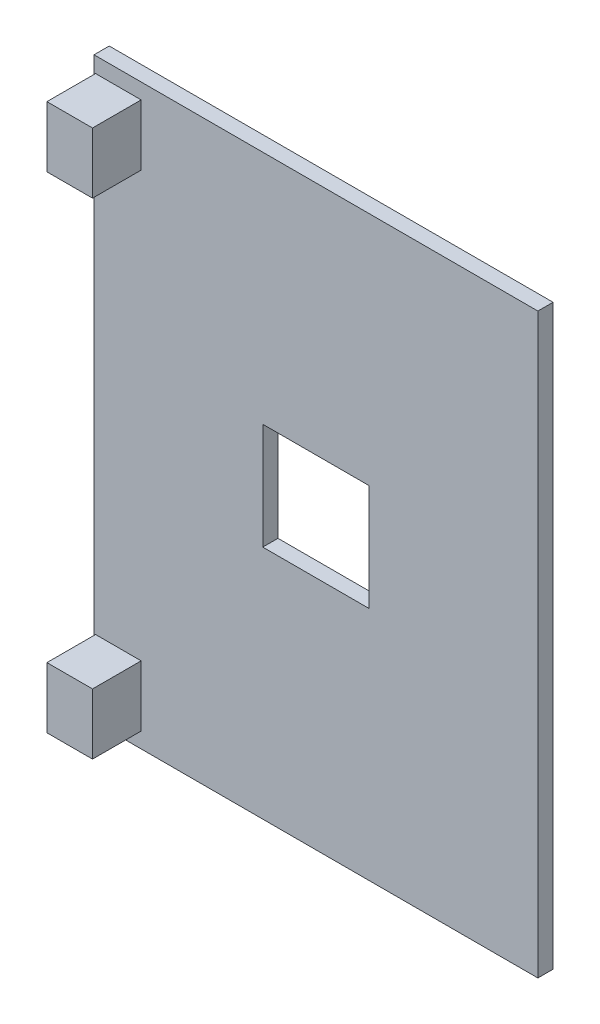
ISO-10303-21;
HEADER;
FILE_DESCRIPTION(('STEP AP214'),'2;1');
FILE_NAME('part.step','',(''),(''),'','','');
FILE_SCHEMA(('AUTOMOTIVE_DESIGN { 1 0 10303 214 1 1 1 1 }'));
ENDSEC;
DATA;
#1=APPLICATION_CONTEXT('core data for automotive mechanical design processes');
#2=APPLICATION_PROTOCOL_DEFINITION('international standard','automotive_design',2000,#1);
#3=PRODUCT_CONTEXT('',#1,'mechanical');
#4=PRODUCT('Part','Part','',(#3));
#5=PRODUCT_RELATED_PRODUCT_CATEGORY('part','',(#4));
#6=PRODUCT_DEFINITION_FORMATION('','',#4);
#7=PRODUCT_DEFINITION_CONTEXT('part definition',#1,'design');
#8=PRODUCT_DEFINITION('design','',#6,#7);
#9=PRODUCT_DEFINITION_SHAPE('','',#8);
#10=(LENGTH_UNIT() NAMED_UNIT(*) SI_UNIT(.MILLI.,.METRE.));
#11=(NAMED_UNIT(*) PLANE_ANGLE_UNIT() SI_UNIT($,.RADIAN.));
#12=(NAMED_UNIT(*) SI_UNIT($,.STERADIAN.) SOLID_ANGLE_UNIT());
#13=UNCERTAINTY_MEASURE_WITH_UNIT(LENGTH_MEASURE(1.E-05),#10,'distance_accuracy_value','');
#14=(GEOMETRIC_REPRESENTATION_CONTEXT(3) GLOBAL_UNCERTAINTY_ASSIGNED_CONTEXT((#13)) GLOBAL_UNIT_ASSIGNED_CONTEXT((#10,
#11,#12)) REPRESENTATION_CONTEXT('',''));
#15=CARTESIAN_POINT('',(0.,0.,0.));
#16=DIRECTION('',(0.,0.,1.));
#17=DIRECTION('',(1.,0.,0.));
#18=AXIS2_PLACEMENT_3D('',#15,#16,#17);
#19=CARTESIAN_POINT('',(0.,0.,5.));
#20=DIRECTION('',(0.,0.,1.));
#21=DIRECTION('',(1.,0.,0.));
#22=AXIS2_PLACEMENT_3D('',#19,#20,#21);
#23=PLANE('',#22);
#24=DIRECTION('',(0.,-1.,0.));
#25=VECTOR('',#24,1.);
#26=CARTESIAN_POINT('',(-52.728613981203,0.694490742526819,5.));
#27=LINE('',#26,#25);
#28=CARTESIAN_POINT('',(-52.728613981203,35.6944907425268,5.));
#29=VERTEX_POINT('',#28);
#30=CARTESIAN_POINT('',(-52.728613981203,0.694490742526819,5.));
#31=VERTEX_POINT('',#30);
#32=EDGE_CURVE('E48',#29,#31,#27,.T.);
#33=ORIENTED_EDGE('',*,*,#32,.F.);
#34=DIRECTION('',(-1.,0.,0.));
#35=VECTOR('',#34,1.);
#36=CARTESIAN_POINT('',(-17.728613981203,35.6944907425268,5.));
#37=LINE('',#36,#35);
#38=CARTESIAN_POINT('',(-17.728613981203,35.6944907425268,5.));
#39=VERTEX_POINT('',#38);
#40=EDGE_CURVE('E164',#39,#29,#37,.T.);
#41=ORIENTED_EDGE('',*,*,#40,.F.);
#42=DIRECTION('',(0.,1.,0.));
#43=VECTOR('',#42,1.);
#44=CARTESIAN_POINT('',(-17.728613981203,0.694490742526824,5.));
#45=LINE('',#44,#43);
#46=CARTESIAN_POINT('',(-17.728613981203,0.694490742526824,5.));
#47=VERTEX_POINT('',#46);
#48=EDGE_CURVE('E149',#47,#39,#45,.T.);
#49=ORIENTED_EDGE('',*,*,#48,.F.);
#50=DIRECTION('',(1.,0.,0.));
#51=VECTOR('',#50,1.);
#52=CARTESIAN_POINT('',(-17.728613981203,0.694490742526824,5.));
#53=LINE('',#52,#51);
#54=EDGE_CURVE('E158',#31,#47,#53,.T.);
#55=ORIENTED_EDGE('',*,*,#54,.F.);
#56=EDGE_LOOP('',(#33,#41,#49,#55));
#57=FACE_BOUND('',#56,.T.);
#58=DIRECTION('',(0.,-1.,0.));
#59=VECTOR('',#58,1.);
#60=CARTESIAN_POINT('',(-108.228613981203,113.194490742527,5.));
#61=LINE('',#60,#59);
#62=CARTESIAN_POINT('',(-108.228613981203,113.194490742527,5.));
#63=VERTEX_POINT('',#62);
#64=CARTESIAN_POINT('',(-108.228613981203,-76.8055092574732,5.));
#65=VERTEX_POINT('',#64);
#66=EDGE_CURVE('E235',#63,#65,#61,.T.);
#67=ORIENTED_EDGE('',*,*,#66,.T.);
#68=DIRECTION('',(1.,0.,0.));
#69=VECTOR('',#68,1.);
#70=CARTESIAN_POINT('',(-108.228613981203,-76.8055092574732,5.));
#71=LINE('',#70,#69);
#72=CARTESIAN_POINT('',(37.771386018797,-76.8055092574732,5.));
#73=VERTEX_POINT('',#72);
#74=EDGE_CURVE('E238',#65,#73,#71,.T.);
#75=ORIENTED_EDGE('',*,*,#74,.T.);
#76=DIRECTION('',(0.,1.,0.));
#77=VECTOR('',#76,1.);
#78=CARTESIAN_POINT('',(37.771386018797,113.194490742527,5.));
#79=LINE('',#78,#77);
#80=CARTESIAN_POINT('',(37.771386018797,113.194490742527,5.));
#81=VERTEX_POINT('',#80);
#82=EDGE_CURVE('E241',#73,#81,#79,.T.);
#83=ORIENTED_EDGE('',*,*,#82,.T.);
#84=DIRECTION('',(-1.,0.,0.));
#85=VECTOR('',#84,1.);
#86=CARTESIAN_POINT('',(-108.228613981203,113.194490742527,5.));
#87=LINE('',#86,#85);
#88=EDGE_CURVE('E243',#81,#63,#87,.T.);
#89=ORIENTED_EDGE('',*,*,#88,.T.);
#90=EDGE_LOOP('',(#67,#75,#83,#89));
#91=FACE_BOUND('',#90,.T.);
#92=DIRECTION('',(1.,0.,0.));
#93=VECTOR('',#92,1.);
#94=CARTESIAN_POINT('',(-107.728613981203,-71.7055092574732,5.));
#95=LINE('',#94,#93);
#96=CARTESIAN_POINT('',(-107.728613981203,-71.7055092574732,5.));
#97=VERTEX_POINT('',#96);
#98=CARTESIAN_POINT('',(-92.728613981203,-71.7055092574732,5.));
#99=VERTEX_POINT('',#98);
#100=EDGE_CURVE('E219',#97,#99,#95,.T.);
#101=ORIENTED_EDGE('',*,*,#100,.F.);
#102=DIRECTION('',(0.,-1.,0.));
#103=VECTOR('',#102,1.);
#104=CARTESIAN_POINT('',(-107.728613981203,-71.7055092574732,5.));
#105=LINE('',#104,#103);
#106=CARTESIAN_POINT('',(-107.728613981203,-51.7055092574732,5.));
#107=VERTEX_POINT('',#106);
#108=EDGE_CURVE('E205',#107,#97,#105,.T.);
#109=ORIENTED_EDGE('',*,*,#108,.F.);
#110=DIRECTION('',(-1.,0.,0.));
#111=VECTOR('',#110,1.);
#112=CARTESIAN_POINT('',(-107.728613981203,-51.7055092574732,5.));
#113=LINE('',#112,#111);
#114=CARTESIAN_POINT('',(-92.728613981203,-51.7055092574732,5.));
#115=VERTEX_POINT('',#114);
#116=EDGE_CURVE('E210',#115,#107,#113,.T.);
#117=ORIENTED_EDGE('',*,*,#116,.F.);
#118=DIRECTION('',(0.,1.,0.));
#119=VECTOR('',#118,1.);
#120=CARTESIAN_POINT('',(-92.728613981203,-71.7055092574732,5.));
#121=LINE('',#120,#119);
#122=EDGE_CURVE('E221',#99,#115,#121,.T.);
#123=ORIENTED_EDGE('',*,*,#122,.F.);
#124=EDGE_LOOP('',(#101,#109,#117,#123));
#125=FACE_BOUND('',#124,.T.);
#126=DIRECTION('',(1.,0.,0.));
#127=VECTOR('',#126,1.);
#128=CARTESIAN_POINT('',(-107.728613981203,88.0944907425268,5.));
#129=LINE('',#128,#127);
#130=CARTESIAN_POINT('',(-107.728613981203,88.0944907425268,5.));
#131=VERTEX_POINT('',#130);
#132=CARTESIAN_POINT('',(-92.728613981203,88.0944907425268,5.));
#133=VERTEX_POINT('',#132);
#134=EDGE_CURVE('E190',#131,#133,#129,.T.);
#135=ORIENTED_EDGE('',*,*,#134,.F.);
#136=DIRECTION('',(0.,-1.,0.));
#137=VECTOR('',#136,1.);
#138=CARTESIAN_POINT('',(-107.728613981203,108.094490742527,5.));
#139=LINE('',#138,#137);
#140=CARTESIAN_POINT('',(-107.728613981203,108.094490742527,5.));
#141=VERTEX_POINT('',#140);
#142=EDGE_CURVE('E175',#141,#131,#139,.T.);
#143=ORIENTED_EDGE('',*,*,#142,.F.);
#144=DIRECTION('',(-1.,0.,0.));
#145=VECTOR('',#144,1.);
#146=CARTESIAN_POINT('',(-107.728613981203,108.094490742527,5.));
#147=LINE('',#146,#145);
#148=CARTESIAN_POINT('',(-92.728613981203,108.094490742527,5.));
#149=VERTEX_POINT('',#148);
#150=EDGE_CURVE('E181',#149,#141,#147,.T.);
#151=ORIENTED_EDGE('',*,*,#150,.F.);
#152=DIRECTION('',(0.,1.,0.));
#153=VECTOR('',#152,1.);
#154=CARTESIAN_POINT('',(-92.728613981203,108.094490742527,5.));
#155=LINE('',#154,#153);
#156=EDGE_CURVE('E192',#133,#149,#155,.T.);
#157=ORIENTED_EDGE('',*,*,#156,.F.);
#158=EDGE_LOOP('',(#135,#143,#151,#157));
#159=FACE_BOUND('',#158,.T.);
#160=ADVANCED_FACE('F33',(#57,#91,#125,#159),#23,.T.);
#161=CARTESIAN_POINT('',(-108.228613981203,113.194490742527,5.));
#162=DIRECTION('',(1.,0.,0.));
#163=DIRECTION('',(0.,1.,0.));
#164=AXIS2_PLACEMENT_3D('',#161,#162,#163);
#165=PLANE('',#164);
#166=DIRECTION('',(0.,-1.,0.));
#167=VECTOR('',#166,1.);
#168=CARTESIAN_POINT('',(-108.228613981203,113.194490742527,0.));
#169=LINE('',#168,#167);
#170=CARTESIAN_POINT('',(-108.228613981203,113.194490742527,0.));
#171=VERTEX_POINT('',#170);
#172=CARTESIAN_POINT('',(-108.228613981203,-76.8055092574732,0.));
#173=VERTEX_POINT('',#172);
#174=EDGE_CURVE('E234',#171,#173,#169,.T.);
#175=ORIENTED_EDGE('',*,*,#174,.T.);
#176=DIRECTION('',(0.,0.,-1.));
#177=VECTOR('',#176,1.);
#178=CARTESIAN_POINT('',(-108.228613981203,-76.8055092574732,5.));
#179=LINE('',#178,#177);
#180=EDGE_CURVE('E11',#65,#173,#179,.T.);
#181=ORIENTED_EDGE('',*,*,#180,.F.);
#182=ORIENTED_EDGE('',*,*,#66,.F.);
#183=DIRECTION('',(0.,0.,-1.));
#184=VECTOR('',#183,1.);
#185=CARTESIAN_POINT('',(-108.228613981203,113.194490742527,5.));
#186=LINE('',#185,#184);
#187=EDGE_CURVE('E245',#63,#171,#186,.T.);
#188=ORIENTED_EDGE('',*,*,#187,.T.);
#189=EDGE_LOOP('',(#175,#181,#182,#188));
#190=FACE_BOUND('',#189,.T.);
#191=ADVANCED_FACE('F35',(#190),#165,.F.);
#192=CARTESIAN_POINT('',(-108.228613981203,-76.8055092574732,5.));
#193=DIRECTION('',(0.,1.,0.));
#194=DIRECTION('',(0.,0.,1.));
#195=AXIS2_PLACEMENT_3D('',#192,#193,#194);
#196=PLANE('',#195);
#197=DIRECTION('',(1.,0.,0.));
#198=VECTOR('',#197,1.);
#199=CARTESIAN_POINT('',(-108.228613981203,-76.8055092574732,0.));
#200=LINE('',#199,#198);
#201=CARTESIAN_POINT('',(37.771386018797,-76.8055092574732,0.));
#202=VERTEX_POINT('',#201);
#203=EDGE_CURVE('E248',#173,#202,#200,.T.);
#204=ORIENTED_EDGE('',*,*,#203,.T.);
#205=DIRECTION('',(0.,0.,-1.));
#206=VECTOR('',#205,1.);
#207=CARTESIAN_POINT('',(37.771386018797,-76.8055092574732,5.));
#208=LINE('',#207,#206);
#209=EDGE_CURVE('E41',#73,#202,#208,.T.);
#210=ORIENTED_EDGE('',*,*,#209,.F.);
#211=ORIENTED_EDGE('',*,*,#74,.F.);
#212=ORIENTED_EDGE('',*,*,#180,.T.);
#213=EDGE_LOOP('',(#204,#210,#211,#212));
#214=FACE_BOUND('',#213,.T.);
#215=ADVANCED_FACE('F277',(#214),#196,.F.);
#216=CARTESIAN_POINT('',(37.771386018797,113.194490742527,5.));
#217=DIRECTION('',(-1.,0.,0.));
#218=DIRECTION('',(0.,-1.,0.));
#219=AXIS2_PLACEMENT_3D('',#216,#217,#218);
#220=PLANE('',#219);
#221=DIRECTION('',(0.,1.,0.));
#222=VECTOR('',#221,1.);
#223=CARTESIAN_POINT('',(37.771386018797,113.194490742527,0.));
#224=LINE('',#223,#222);
#225=CARTESIAN_POINT('',(37.771386018797,113.194490742527,0.));
#226=VERTEX_POINT('',#225);
#227=EDGE_CURVE('E250',#202,#226,#224,.T.);
#228=ORIENTED_EDGE('',*,*,#227,.T.);
#229=DIRECTION('',(0.,0.,-1.));
#230=VECTOR('',#229,1.);
#231=CARTESIAN_POINT('',(37.771386018797,113.194490742527,5.));
#232=LINE('',#231,#230);
#233=EDGE_CURVE('E255',#81,#226,#232,.T.);
#234=ORIENTED_EDGE('',*,*,#233,.F.);
#235=ORIENTED_EDGE('',*,*,#82,.F.);
#236=ORIENTED_EDGE('',*,*,#209,.T.);
#237=EDGE_LOOP('',(#228,#234,#235,#236));
#238=FACE_BOUND('',#237,.T.);
#239=ADVANCED_FACE('F262',(#238),#220,.F.);
#240=CARTESIAN_POINT('',(-108.228613981203,113.194490742527,5.));
#241=DIRECTION('',(0.,-1.,0.));
#242=DIRECTION('',(0.,0.,-1.));
#243=AXIS2_PLACEMENT_3D('',#240,#241,#242);
#244=PLANE('',#243);
#245=DIRECTION('',(-1.,0.,0.));
#246=VECTOR('',#245,1.);
#247=CARTESIAN_POINT('',(-108.228613981203,113.194490742527,0.));
#248=LINE('',#247,#246);
#249=EDGE_CURVE('E239',#226,#171,#248,.T.);
#250=ORIENTED_EDGE('',*,*,#249,.T.);
#251=ORIENTED_EDGE('',*,*,#187,.F.);
#252=ORIENTED_EDGE('',*,*,#88,.F.);
#253=ORIENTED_EDGE('',*,*,#233,.T.);
#254=EDGE_LOOP('',(#250,#251,#252,#253));
#255=FACE_BOUND('',#254,.T.);
#256=ADVANCED_FACE('F271',(#255),#244,.F.);
#257=CARTESIAN_POINT('',(0.,0.,0.));
#258=DIRECTION('',(0.,0.,1.));
#259=DIRECTION('',(1.,0.,0.));
#260=AXIS2_PLACEMENT_3D('',#257,#258,#259);
#261=PLANE('',#260);
#262=DIRECTION('',(1.,0.,0.));
#263=VECTOR('',#262,1.);
#264=CARTESIAN_POINT('',(-17.728613981203,35.6944907425268,0.));
#265=LINE('',#264,#263);
#266=CARTESIAN_POINT('',(-52.728613981203,35.6944907425268,0.));
#267=VERTEX_POINT('',#266);
#268=CARTESIAN_POINT('',(-17.728613981203,35.6944907425268,0.));
#269=VERTEX_POINT('',#268);
#270=EDGE_CURVE('E462',#267,#269,#265,.T.);
#271=ORIENTED_EDGE('',*,*,#270,.F.);
#272=DIRECTION('',(0.,1.,0.));
#273=VECTOR('',#272,1.);
#274=CARTESIAN_POINT('',(-52.728613981203,0.694490742526819,0.));
#275=LINE('',#274,#273);
#276=CARTESIAN_POINT('',(-52.728613981203,0.694490742526819,0.));
#277=VERTEX_POINT('',#276);
#278=EDGE_CURVE('E176',#277,#267,#275,.T.);
#279=ORIENTED_EDGE('',*,*,#278,.F.);
#280=DIRECTION('',(-1.,0.,0.));
#281=VECTOR('',#280,1.);
#282=CARTESIAN_POINT('',(-17.728613981203,0.694490742526824,0.));
#283=LINE('',#282,#281);
#284=CARTESIAN_POINT('',(-17.728613981203,0.694490742526824,0.));
#285=VERTEX_POINT('',#284);
#286=EDGE_CURVE('E173',#285,#277,#283,.T.);
#287=ORIENTED_EDGE('',*,*,#286,.F.);
#288=DIRECTION('',(0.,-1.,0.));
#289=VECTOR('',#288,1.);
#290=CARTESIAN_POINT('',(-17.728613981203,0.694490742526824,0.));
#291=LINE('',#290,#289);
#292=EDGE_CURVE('E152',#269,#285,#291,.T.);
#293=ORIENTED_EDGE('',*,*,#292,.F.);
#294=EDGE_LOOP('',(#271,#279,#287,#293));
#295=FACE_BOUND('',#294,.T.);
#296=ORIENTED_EDGE('',*,*,#174,.F.);
#297=ORIENTED_EDGE('',*,*,#249,.F.);
#298=ORIENTED_EDGE('',*,*,#227,.F.);
#299=ORIENTED_EDGE('',*,*,#203,.F.);
#300=EDGE_LOOP('',(#296,#297,#298,#299));
#301=FACE_BOUND('',#300,.T.);
#302=ADVANCED_FACE('F268',(#295,#301),#261,.F.);
#303=CARTESIAN_POINT('',(-107.728613981203,-71.7055092574732,21.));
#304=DIRECTION('',(1.,0.,0.));
#305=DIRECTION('',(0.,0.,-1.));
#306=AXIS2_PLACEMENT_3D('',#303,#304,#305);
#307=PLANE('',#306);
#308=ORIENTED_EDGE('',*,*,#108,.T.);
#309=DIRECTION('',(0.,0.,-1.));
#310=VECTOR('',#309,1.);
#311=CARTESIAN_POINT('',(-107.728613981203,-71.7055092574732,21.));
#312=LINE('',#311,#310);
#313=CARTESIAN_POINT('',(-107.728613981203,-71.7055092574732,21.));
#314=VERTEX_POINT('',#313);
#315=EDGE_CURVE('E232',#314,#97,#312,.T.);
#316=ORIENTED_EDGE('',*,*,#315,.F.);
#317=DIRECTION('',(0.,-1.,0.));
#318=VECTOR('',#317,1.);
#319=CARTESIAN_POINT('',(-107.728613981203,-71.7055092574732,21.));
#320=LINE('',#319,#318);
#321=CARTESIAN_POINT('',(-107.728613981203,-51.7055092574732,21.));
#322=VERTEX_POINT('',#321);
#323=EDGE_CURVE('E206',#322,#314,#320,.T.);
#324=ORIENTED_EDGE('',*,*,#323,.F.);
#325=DIRECTION('',(0.,0.,-1.));
#326=VECTOR('',#325,1.);
#327=CARTESIAN_POINT('',(-107.728613981203,-51.7055092574732,21.));
#328=LINE('',#327,#326);
#329=EDGE_CURVE('E216',#322,#107,#328,.T.);
#330=ORIENTED_EDGE('',*,*,#329,.T.);
#331=EDGE_LOOP('',(#308,#316,#324,#330));
#332=FACE_BOUND('',#331,.T.);
#333=ADVANCED_FACE('F290',(#332),#307,.F.);
#334=CARTESIAN_POINT('',(-107.728613981203,-71.7055092574732,21.));
#335=DIRECTION('',(0.,1.,0.));
#336=DIRECTION('',(0.,0.,1.));
#337=AXIS2_PLACEMENT_3D('',#334,#335,#336);
#338=PLANE('',#337);
#339=ORIENTED_EDGE('',*,*,#100,.T.);
#340=DIRECTION('',(0.,0.,-1.));
#341=VECTOR('',#340,1.);
#342=CARTESIAN_POINT('',(-92.728613981203,-71.7055092574732,21.));
#343=LINE('',#342,#341);
#344=CARTESIAN_POINT('',(-92.728613981203,-71.7055092574732,21.));
#345=VERTEX_POINT('',#344);
#346=EDGE_CURVE('E229',#345,#99,#343,.T.);
#347=ORIENTED_EDGE('',*,*,#346,.F.);
#348=DIRECTION('',(1.,0.,0.));
#349=VECTOR('',#348,1.);
#350=CARTESIAN_POINT('',(-107.728613981203,-71.7055092574732,21.));
#351=LINE('',#350,#349);
#352=EDGE_CURVE('E209',#314,#345,#351,.T.);
#353=ORIENTED_EDGE('',*,*,#352,.F.);
#354=ORIENTED_EDGE('',*,*,#315,.T.);
#355=EDGE_LOOP('',(#339,#347,#353,#354));
#356=FACE_BOUND('',#355,.T.);
#357=ADVANCED_FACE('F311',(#356),#338,.F.);
#358=CARTESIAN_POINT('',(-92.728613981203,-71.7055092574732,21.));
#359=DIRECTION('',(-1.,0.,0.));
#360=DIRECTION('',(0.,0.,1.));
#361=AXIS2_PLACEMENT_3D('',#358,#359,#360);
#362=PLANE('',#361);
#363=ORIENTED_EDGE('',*,*,#122,.T.);
#364=DIRECTION('',(0.,0.,-1.));
#365=VECTOR('',#364,1.);
#366=CARTESIAN_POINT('',(-92.728613981203,-51.7055092574732,21.));
#367=LINE('',#366,#365);
#368=CARTESIAN_POINT('',(-92.728613981203,-51.7055092574732,21.));
#369=VERTEX_POINT('',#368);
#370=EDGE_CURVE('E227',#369,#115,#367,.T.);
#371=ORIENTED_EDGE('',*,*,#370,.F.);
#372=DIRECTION('',(0.,1.,0.));
#373=VECTOR('',#372,1.);
#374=CARTESIAN_POINT('',(-92.728613981203,-71.7055092574732,21.));
#375=LINE('',#374,#373);
#376=EDGE_CURVE('E212',#345,#369,#375,.T.);
#377=ORIENTED_EDGE('',*,*,#376,.F.);
#378=ORIENTED_EDGE('',*,*,#346,.T.);
#379=EDGE_LOOP('',(#363,#371,#377,#378));
#380=FACE_BOUND('',#379,.T.);
#381=ADVANCED_FACE('F318',(#380),#362,.F.);
#382=CARTESIAN_POINT('',(-107.728613981203,-51.7055092574732,21.));
#383=DIRECTION('',(0.,-1.,0.));
#384=DIRECTION('',(0.,0.,-1.));
#385=AXIS2_PLACEMENT_3D('',#382,#383,#384);
#386=PLANE('',#385);
#387=ORIENTED_EDGE('',*,*,#116,.T.);
#388=ORIENTED_EDGE('',*,*,#329,.F.);
#389=DIRECTION('',(-1.,0.,0.));
#390=VECTOR('',#389,1.);
#391=CARTESIAN_POINT('',(-107.728613981203,-51.7055092574732,21.));
#392=LINE('',#391,#390);
#393=EDGE_CURVE('E214',#369,#322,#392,.T.);
#394=ORIENTED_EDGE('',*,*,#393,.F.);
#395=ORIENTED_EDGE('',*,*,#370,.T.);
#396=EDGE_LOOP('',(#387,#388,#394,#395));
#397=FACE_BOUND('',#396,.T.);
#398=ADVANCED_FACE('F325',(#397),#386,.F.);
#399=CARTESIAN_POINT('',(0.,0.,21.));
#400=DIRECTION('',(0.,0.,-1.));
#401=DIRECTION('',(-1.,0.,0.));
#402=AXIS2_PLACEMENT_3D('',#399,#400,#401);
#403=PLANE('',#402);
#404=ORIENTED_EDGE('',*,*,#323,.T.);
#405=ORIENTED_EDGE('',*,*,#352,.T.);
#406=ORIENTED_EDGE('',*,*,#376,.T.);
#407=ORIENTED_EDGE('',*,*,#393,.T.);
#408=EDGE_LOOP('',(#404,#405,#406,#407));
#409=FACE_BOUND('',#408,.T.);
#410=ADVANCED_FACE('F333',(#409),#403,.F.);
#411=CARTESIAN_POINT('',(-107.728613981203,108.094490742527,21.));
#412=DIRECTION('',(1.,0.,0.));
#413=DIRECTION('',(0.,0.,-1.));
#414=AXIS2_PLACEMENT_3D('',#411,#412,#413);
#415=PLANE('',#414);
#416=ORIENTED_EDGE('',*,*,#142,.T.);
#417=DIRECTION('',(0.,0.,-1.));
#418=VECTOR('',#417,1.);
#419=CARTESIAN_POINT('',(-107.728613981203,88.0944907425268,21.));
#420=LINE('',#419,#418);
#421=CARTESIAN_POINT('',(-107.728613981203,88.0944907425268,21.));
#422=VERTEX_POINT('',#421);
#423=EDGE_CURVE('E203',#422,#131,#420,.T.);
#424=ORIENTED_EDGE('',*,*,#423,.F.);
#425=DIRECTION('',(0.,-1.,0.));
#426=VECTOR('',#425,1.);
#427=CARTESIAN_POINT('',(-107.728613981203,108.094490742527,21.));
#428=LINE('',#427,#426);
#429=CARTESIAN_POINT('',(-107.728613981203,108.094490742527,21.));
#430=VERTEX_POINT('',#429);
#431=EDGE_CURVE('E177',#430,#422,#428,.T.);
#432=ORIENTED_EDGE('',*,*,#431,.F.);
#433=DIRECTION('',(0.,0.,-1.));
#434=VECTOR('',#433,1.);
#435=CARTESIAN_POINT('',(-107.728613981203,108.094490742527,21.));
#436=LINE('',#435,#434);
#437=EDGE_CURVE('E187',#430,#141,#436,.T.);
#438=ORIENTED_EDGE('',*,*,#437,.T.);
#439=EDGE_LOOP('',(#416,#424,#432,#438));
#440=FACE_BOUND('',#439,.T.);
#441=ADVANCED_FACE('F341',(#440),#415,.F.);
#442=CARTESIAN_POINT('',(-107.728613981203,88.0944907425268,21.));
#443=DIRECTION('',(0.,1.,0.));
#444=DIRECTION('',(0.,0.,1.));
#445=AXIS2_PLACEMENT_3D('',#442,#443,#444);
#446=PLANE('',#445);
#447=ORIENTED_EDGE('',*,*,#134,.T.);
#448=DIRECTION('',(0.,0.,-1.));
#449=VECTOR('',#448,1.);
#450=CARTESIAN_POINT('',(-92.728613981203,88.0944907425268,21.));
#451=LINE('',#450,#449);
#452=CARTESIAN_POINT('',(-92.728613981203,88.0944907425268,21.));
#453=VERTEX_POINT('',#452);
#454=EDGE_CURVE('E200',#453,#133,#451,.T.);
#455=ORIENTED_EDGE('',*,*,#454,.F.);
#456=DIRECTION('',(1.,0.,0.));
#457=VECTOR('',#456,1.);
#458=CARTESIAN_POINT('',(-107.728613981203,88.0944907425268,21.));
#459=LINE('',#458,#457);
#460=EDGE_CURVE('E180',#422,#453,#459,.T.);
#461=ORIENTED_EDGE('',*,*,#460,.F.);
#462=ORIENTED_EDGE('',*,*,#423,.T.);
#463=EDGE_LOOP('',(#447,#455,#461,#462));
#464=FACE_BOUND('',#463,.T.);
#465=ADVANCED_FACE('F349',(#464),#446,.F.);
#466=CARTESIAN_POINT('',(-92.728613981203,108.094490742527,21.));
#467=DIRECTION('',(-1.,0.,0.));
#468=DIRECTION('',(0.,0.,1.));
#469=AXIS2_PLACEMENT_3D('',#466,#467,#468);
#470=PLANE('',#469);
#471=ORIENTED_EDGE('',*,*,#156,.T.);
#472=DIRECTION('',(0.,0.,-1.));
#473=VECTOR('',#472,1.);
#474=CARTESIAN_POINT('',(-92.728613981203,108.094490742527,21.));
#475=LINE('',#474,#473);
#476=CARTESIAN_POINT('',(-92.728613981203,108.094490742527,21.));
#477=VERTEX_POINT('',#476);
#478=EDGE_CURVE('E198',#477,#149,#475,.T.);
#479=ORIENTED_EDGE('',*,*,#478,.F.);
#480=DIRECTION('',(0.,1.,0.));
#481=VECTOR('',#480,1.);
#482=CARTESIAN_POINT('',(-92.728613981203,108.094490742527,21.));
#483=LINE('',#482,#481);
#484=EDGE_CURVE('E183',#453,#477,#483,.T.);
#485=ORIENTED_EDGE('',*,*,#484,.F.);
#486=ORIENTED_EDGE('',*,*,#454,.T.);
#487=EDGE_LOOP('',(#471,#479,#485,#486));
#488=FACE_BOUND('',#487,.T.);
#489=ADVANCED_FACE('F357',(#488),#470,.F.);
#490=CARTESIAN_POINT('',(-107.728613981203,108.094490742527,21.));
#491=DIRECTION('',(0.,-1.,0.));
#492=DIRECTION('',(0.,0.,-1.));
#493=AXIS2_PLACEMENT_3D('',#490,#491,#492);
#494=PLANE('',#493);
#495=ORIENTED_EDGE('',*,*,#150,.T.);
#496=ORIENTED_EDGE('',*,*,#437,.F.);
#497=DIRECTION('',(-1.,0.,0.));
#498=VECTOR('',#497,1.);
#499=CARTESIAN_POINT('',(-107.728613981203,108.094490742527,21.));
#500=LINE('',#499,#498);
#501=EDGE_CURVE('E185',#477,#430,#500,.T.);
#502=ORIENTED_EDGE('',*,*,#501,.F.);
#503=ORIENTED_EDGE('',*,*,#478,.T.);
#504=EDGE_LOOP('',(#495,#496,#502,#503));
#505=FACE_BOUND('',#504,.T.);
#506=ADVANCED_FACE('F365',(#505),#494,.F.);
#507=CARTESIAN_POINT('',(0.,0.,21.));
#508=DIRECTION('',(0.,0.,1.));
#509=DIRECTION('',(1.,0.,0.));
#510=AXIS2_PLACEMENT_3D('',#507,#508,#509);
#511=PLANE('',#510);
#512=ORIENTED_EDGE('',*,*,#431,.T.);
#513=ORIENTED_EDGE('',*,*,#460,.T.);
#514=ORIENTED_EDGE('',*,*,#484,.T.);
#515=ORIENTED_EDGE('',*,*,#501,.T.);
#516=EDGE_LOOP('',(#512,#513,#514,#515));
#517=FACE_BOUND('',#516,.T.);
#518=ADVANCED_FACE('F373',(#517),#511,.T.);
#519=CARTESIAN_POINT('',(-52.728613981203,0.694490742526819,-49.4974746830583));
#520=DIRECTION('',(-1.,0.,0.));
#521=DIRECTION('',(0.,0.,1.));
#522=AXIS2_PLACEMENT_3D('',#519,#520,#521);
#523=PLANE('',#522);
#524=ORIENTED_EDGE('',*,*,#278,.T.);
#525=DIRECTION('',(0.,0.,1.));
#526=VECTOR('',#525,1.);
#527=CARTESIAN_POINT('',(-52.728613981203,35.6944907425268,-49.4974746830583));
#528=LINE('',#527,#526);
#529=EDGE_CURVE('E169',#267,#29,#528,.T.);
#530=ORIENTED_EDGE('',*,*,#529,.T.);
#531=ORIENTED_EDGE('',*,*,#32,.T.);
#532=DIRECTION('',(0.,0.,1.));
#533=VECTOR('',#532,1.);
#534=CARTESIAN_POINT('',(-52.728613981203,0.694490742526819,-49.4974746830583));
#535=LINE('',#534,#533);
#536=EDGE_CURVE('E155',#277,#31,#535,.T.);
#537=ORIENTED_EDGE('',*,*,#536,.F.);
#538=EDGE_LOOP('',(#524,#530,#531,#537));
#539=FACE_BOUND('',#538,.T.);
#540=ADVANCED_FACE('F381',(#539),#523,.F.);
#541=CARTESIAN_POINT('',(-17.728613981203,35.6944907425268,-49.4974746830583));
#542=DIRECTION('',(0.,1.,0.));
#543=DIRECTION('',(-1.,0.,0.));
#544=AXIS2_PLACEMENT_3D('',#541,#542,#543);
#545=PLANE('',#544);
#546=ORIENTED_EDGE('',*,*,#270,.T.);
#547=DIRECTION('',(0.,0.,1.));
#548=VECTOR('',#547,1.);
#549=CARTESIAN_POINT('',(-17.728613981203,35.6944907425268,-49.4974746830583));
#550=LINE('',#549,#548);
#551=EDGE_CURVE('E154',#269,#39,#550,.T.);
#552=ORIENTED_EDGE('',*,*,#551,.T.);
#553=ORIENTED_EDGE('',*,*,#40,.T.);
#554=ORIENTED_EDGE('',*,*,#529,.F.);
#555=EDGE_LOOP('',(#546,#552,#553,#554));
#556=FACE_BOUND('',#555,.T.);
#557=ADVANCED_FACE('F388',(#556),#545,.F.);
#558=CARTESIAN_POINT('',(-17.728613981203,0.694490742526824,-49.4974746830583));
#559=DIRECTION('',(1.,0.,0.));
#560=DIRECTION('',(0.,0.,-1.));
#561=AXIS2_PLACEMENT_3D('',#558,#559,#560);
#562=PLANE('',#561);
#563=ORIENTED_EDGE('',*,*,#292,.T.);
#564=DIRECTION('',(0.,0.,1.));
#565=VECTOR('',#564,1.);
#566=CARTESIAN_POINT('',(-17.728613981203,0.694490742526824,-49.4974746830583));
#567=LINE('',#566,#565);
#568=EDGE_CURVE('E56',#285,#47,#567,.T.);
#569=ORIENTED_EDGE('',*,*,#568,.T.);
#570=ORIENTED_EDGE('',*,*,#48,.T.);
#571=ORIENTED_EDGE('',*,*,#551,.F.);
#572=EDGE_LOOP('',(#563,#569,#570,#571));
#573=FACE_BOUND('',#572,.T.);
#574=ADVANCED_FACE('F146',(#573),#562,.F.);
#575=CARTESIAN_POINT('',(-17.728613981203,0.694490742526824,-49.4974746830583));
#576=DIRECTION('',(0.,-1.,0.));
#577=DIRECTION('',(1.,0.,0.));
#578=AXIS2_PLACEMENT_3D('',#575,#576,#577);
#579=PLANE('',#578);
#580=ORIENTED_EDGE('',*,*,#286,.T.);
#581=ORIENTED_EDGE('',*,*,#536,.T.);
#582=ORIENTED_EDGE('',*,*,#54,.T.);
#583=ORIENTED_EDGE('',*,*,#568,.F.);
#584=EDGE_LOOP('',(#580,#581,#582,#583));
#585=FACE_BOUND('',#584,.T.);
#586=ADVANCED_FACE('F159',(#585),#579,.F.);
#587=CLOSED_SHELL('',(#160,#191,#215,#239,#256,#302,#333,#357,#381,#398,#410,#441,#465,#489,
#506,#518,#540,#557,#574,#586));
#588=MANIFOLD_SOLID_BREP('B2',#587);
#589=ADVANCED_BREP_SHAPE_REPRESENTATION('',(#18,#588),#14);
#590=SHAPE_DEFINITION_REPRESENTATION(#9,#589);
ENDSEC;
END-ISO-10303-21;
